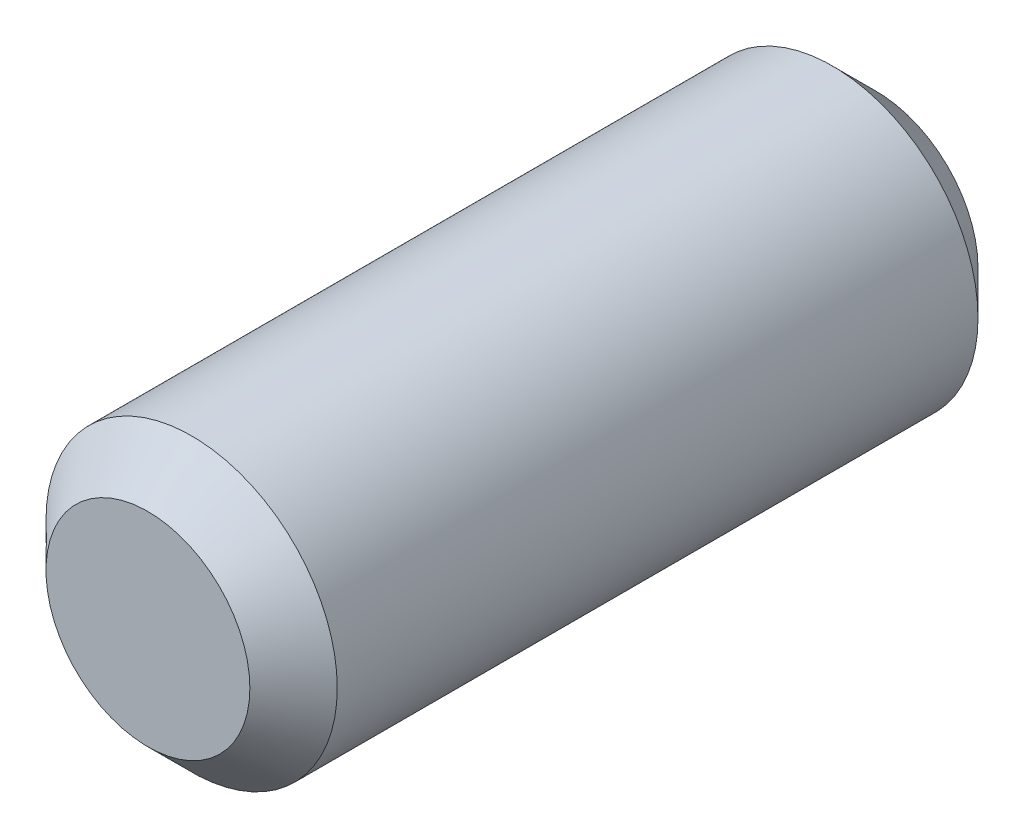
ISO-10303-21;
HEADER;
FILE_DESCRIPTION(('STEP AP214'),'2;1');
FILE_NAME('part.step','',(''),(''),'','','');
FILE_SCHEMA(('AUTOMOTIVE_DESIGN { 1 0 10303 214 1 1 1 1 }'));
ENDSEC;
DATA;
#1=APPLICATION_CONTEXT('core data for automotive mechanical design processes');
#2=APPLICATION_PROTOCOL_DEFINITION('international standard','automotive_design',2000,#1);
#3=PRODUCT_CONTEXT('',#1,'mechanical');
#4=PRODUCT('Part','Part','',(#3));
#5=PRODUCT_RELATED_PRODUCT_CATEGORY('part','',(#4));
#6=PRODUCT_DEFINITION_FORMATION('','',#4);
#7=PRODUCT_DEFINITION_CONTEXT('part definition',#1,'design');
#8=PRODUCT_DEFINITION('design','',#6,#7);
#9=PRODUCT_DEFINITION_SHAPE('','',#8);
#10=(LENGTH_UNIT() NAMED_UNIT(*) SI_UNIT(.MILLI.,.METRE.));
#11=(NAMED_UNIT(*) PLANE_ANGLE_UNIT() SI_UNIT($,.RADIAN.));
#12=(NAMED_UNIT(*) SI_UNIT($,.STERADIAN.) SOLID_ANGLE_UNIT());
#13=UNCERTAINTY_MEASURE_WITH_UNIT(LENGTH_MEASURE(1.E-05),#10,'distance_accuracy_value','');
#14=(GEOMETRIC_REPRESENTATION_CONTEXT(3) GLOBAL_UNCERTAINTY_ASSIGNED_CONTEXT((#13)) GLOBAL_UNIT_ASSIGNED_CONTEXT((#10,
#11,#12)) REPRESENTATION_CONTEXT('',''));
#15=CARTESIAN_POINT('',(0.,0.,0.));
#16=DIRECTION('',(0.,0.,1.));
#17=DIRECTION('',(1.,0.,0.));
#18=AXIS2_PLACEMENT_3D('',#15,#16,#17);
#19=CARTESIAN_POINT('',(0.,0.,-2.5));
#20=DIRECTION('',(0.,0.,1.));
#21=DIRECTION('',(1.,0.,0.));
#22=AXIS2_PLACEMENT_3D('',#19,#20,#21);
#23=CYLINDRICAL_SURFACE('',#22,1.);
#24=CARTESIAN_POINT('',(0.,0.,-2.2));
#25=DIRECTION('',(0.,0.,1.));
#26=DIRECTION('',(1.,0.,0.));
#27=AXIS2_PLACEMENT_3D('',#24,#25,#26);
#28=CIRCLE('',#27,1.);
#29=CARTESIAN_POINT('',(1.,0.,-2.2));
#30=VERTEX_POINT('',#29);
#31=EDGE_CURVE('E48',#30,#30,#28,.T.);
#32=ORIENTED_EDGE('',*,*,#31,.T.);
#33=EDGE_LOOP('',(#32));
#34=FACE_BOUND('',#33,.T.);
#35=CARTESIAN_POINT('',(0.,0.,2.2));
#36=DIRECTION('',(0.,0.,1.));
#37=DIRECTION('',(1.,0.,0.));
#38=AXIS2_PLACEMENT_3D('',#35,#36,#37);
#39=CIRCLE('',#38,1.);
#40=CARTESIAN_POINT('',(1.,0.,2.2));
#41=VERTEX_POINT('',#40);
#42=EDGE_CURVE('E52',#41,#41,#39,.F.);
#43=ORIENTED_EDGE('',*,*,#42,.T.);
#44=EDGE_LOOP('',(#43));
#45=FACE_BOUND('',#44,.T.);
#46=ADVANCED_FACE('F36',(#34,#45),#23,.T.);
#47=CARTESIAN_POINT('',(0.,0.,-2.5));
#48=DIRECTION('',(0.,0.,1.));
#49=DIRECTION('',(1.,0.,0.));
#50=AXIS2_PLACEMENT_3D('',#47,#48,#49);
#51=PLANE('',#50);
#52=CARTESIAN_POINT('',(0.,0.,-2.5));
#53=DIRECTION('',(0.,0.,1.));
#54=DIRECTION('',(1.,0.,0.));
#55=AXIS2_PLACEMENT_3D('',#52,#53,#54);
#56=CIRCLE('',#55,0.7);
#57=CARTESIAN_POINT('',(0.7,0.,-2.5));
#58=VERTEX_POINT('',#57);
#59=EDGE_CURVE('E44',#58,#58,#56,.F.);
#60=ORIENTED_EDGE('',*,*,#59,.T.);
#61=EDGE_LOOP('',(#60));
#62=FACE_BOUND('',#61,.T.);
#63=ADVANCED_FACE('F68',(#62),#51,.F.);
#64=CARTESIAN_POINT('',(0.,0.,2.5));
#65=DIRECTION('',(0.,0.,1.));
#66=DIRECTION('',(1.,0.,0.));
#67=AXIS2_PLACEMENT_3D('',#64,#65,#66);
#68=PLANE('',#67);
#69=CARTESIAN_POINT('',(0.,0.,2.5));
#70=DIRECTION('',(0.,0.,1.));
#71=DIRECTION('',(1.,0.,0.));
#72=AXIS2_PLACEMENT_3D('',#69,#70,#71);
#73=CIRCLE('',#72,0.699999999999999);
#74=CARTESIAN_POINT('',(0.699999999999999,0.,2.5));
#75=VERTEX_POINT('',#74);
#76=EDGE_CURVE('E10',#75,#75,#73,.T.);
#77=ORIENTED_EDGE('',*,*,#76,.T.);
#78=EDGE_LOOP('',(#77));
#79=FACE_BOUND('',#78,.T.);
#80=ADVANCED_FACE('F65',(#79),#68,.T.);
#81=CARTESIAN_POINT('',(0.,0.,-2.2));
#82=DIRECTION('',(0.,0.,1.));
#83=DIRECTION('',(1.,0.,0.));
#84=AXIS2_PLACEMENT_3D('',#81,#82,#83);
#85=CONICAL_SURFACE('',#84,1.,0.78539816339745);
#86=ORIENTED_EDGE('',*,*,#59,.F.);
#87=EDGE_LOOP('',(#86));
#88=FACE_BOUND('',#87,.T.);
#89=ORIENTED_EDGE('',*,*,#31,.F.);
#90=EDGE_LOOP('',(#89));
#91=FACE_BOUND('',#90,.T.);
#92=ADVANCED_FACE('F61',(#88,#91),#85,.T.);
#93=CARTESIAN_POINT('',(0.,0.,2.5));
#94=DIRECTION('',(0.,0.,-1.));
#95=DIRECTION('',(-1.,0.,0.));
#96=AXIS2_PLACEMENT_3D('',#93,#94,#95);
#97=CONICAL_SURFACE('',#96,0.699999999999999,0.785398163397445);
#98=ORIENTED_EDGE('',*,*,#42,.F.);
#99=EDGE_LOOP('',(#98));
#100=FACE_BOUND('',#99,.T.);
#101=ORIENTED_EDGE('',*,*,#76,.F.);
#102=EDGE_LOOP('',(#101));
#103=FACE_BOUND('',#102,.T.);
#104=ADVANCED_FACE('F39',(#100,#103),#97,.T.);
#105=CLOSED_SHELL('',(#46,#63,#80,#92,#104));
#106=MANIFOLD_SOLID_BREP('B2',#105);
#107=ADVANCED_BREP_SHAPE_REPRESENTATION('',(#18,#106),#14);
#108=SHAPE_DEFINITION_REPRESENTATION(#9,#107);
ENDSEC;
END-ISO-10303-21;
